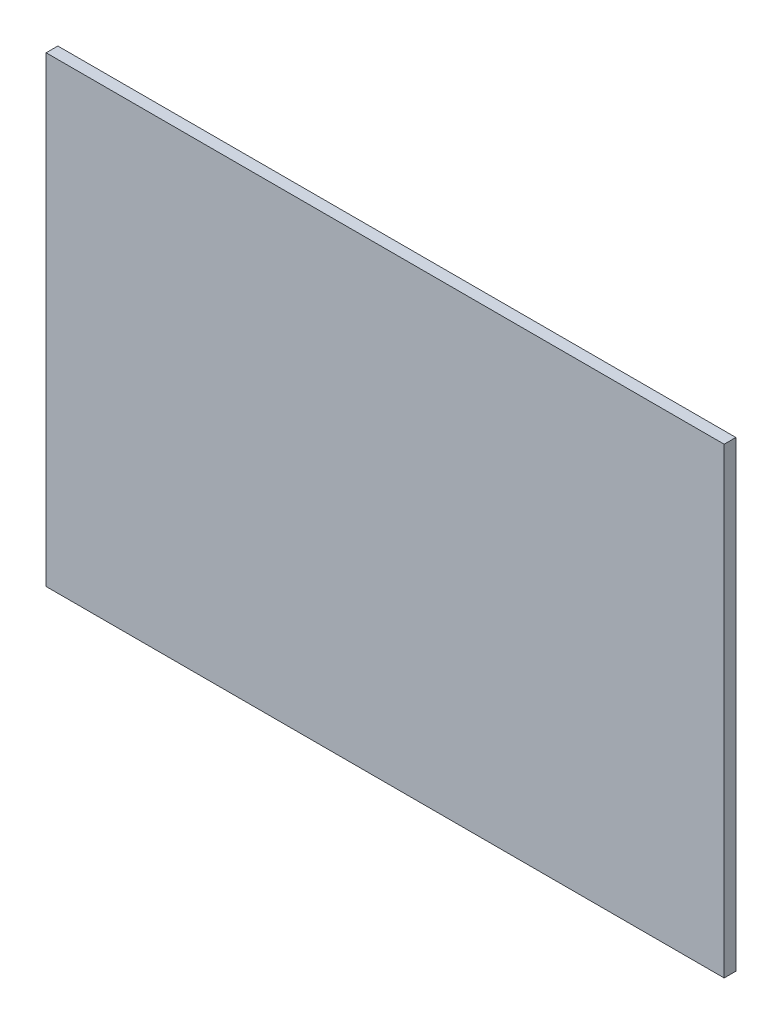
ISO-10303-21;
HEADER;
FILE_DESCRIPTION(('STEP AP214'),'2;1');
FILE_NAME('part.step','',(''),(''),'','','');
FILE_SCHEMA(('AUTOMOTIVE_DESIGN { 1 0 10303 214 1 1 1 1 }'));
ENDSEC;
DATA;
#1=APPLICATION_CONTEXT('core data for automotive mechanical design processes');
#2=APPLICATION_PROTOCOL_DEFINITION('international standard','automotive_design',2000,#1);
#3=PRODUCT_CONTEXT('',#1,'mechanical');
#4=PRODUCT('Part','Part','',(#3));
#5=PRODUCT_RELATED_PRODUCT_CATEGORY('part','',(#4));
#6=PRODUCT_DEFINITION_FORMATION('','',#4);
#7=PRODUCT_DEFINITION_CONTEXT('part definition',#1,'design');
#8=PRODUCT_DEFINITION('design','',#6,#7);
#9=PRODUCT_DEFINITION_SHAPE('','',#8);
#10=(LENGTH_UNIT() NAMED_UNIT(*) SI_UNIT(.MILLI.,.METRE.));
#11=(NAMED_UNIT(*) PLANE_ANGLE_UNIT() SI_UNIT($,.RADIAN.));
#12=(NAMED_UNIT(*) SI_UNIT($,.STERADIAN.) SOLID_ANGLE_UNIT());
#13=UNCERTAINTY_MEASURE_WITH_UNIT(LENGTH_MEASURE(1.E-05),#10,'distance_accuracy_value','');
#14=(GEOMETRIC_REPRESENTATION_CONTEXT(3) GLOBAL_UNCERTAINTY_ASSIGNED_CONTEXT((#13)) GLOBAL_UNIT_ASSIGNED_CONTEXT((#10,
#11,#12)) REPRESENTATION_CONTEXT('',''));
#15=CARTESIAN_POINT('',(0.,0.,0.));
#16=DIRECTION('',(0.,0.,1.));
#17=DIRECTION('',(1.,0.,0.));
#18=AXIS2_PLACEMENT_3D('',#15,#16,#17);
#19=CARTESIAN_POINT('',(139.7,-95.25,4.826));
#20=DIRECTION('',(-1.,0.,0.));
#21=DIRECTION('',(0.,0.,1.));
#22=AXIS2_PLACEMENT_3D('',#19,#20,#21);
#23=PLANE('',#22);
#24=DIRECTION('',(0.,1.,0.));
#25=VECTOR('',#24,1.);
#26=CARTESIAN_POINT('',(139.7,-95.25,0.));
#27=LINE('',#26,#25);
#28=CARTESIAN_POINT('',(139.7,-95.25,0.));
#29=VERTEX_POINT('',#28);
#30=CARTESIAN_POINT('',(139.7,95.25,0.));
#31=VERTEX_POINT('',#30);
#32=EDGE_CURVE('E107',#29,#31,#27,.T.);
#33=ORIENTED_EDGE('',*,*,#32,.T.);
#34=DIRECTION('',(0.,0.,-1.));
#35=VECTOR('',#34,1.);
#36=CARTESIAN_POINT('',(139.7,95.25,4.826));
#37=LINE('',#36,#35);
#38=CARTESIAN_POINT('',(139.7,95.25,4.826));
#39=VERTEX_POINT('',#38);
#40=EDGE_CURVE('E11',#39,#31,#37,.T.);
#41=ORIENTED_EDGE('',*,*,#40,.F.);
#42=DIRECTION('',(0.,1.,0.));
#43=VECTOR('',#42,1.);
#44=CARTESIAN_POINT('',(139.7,-95.25,4.826));
#45=LINE('',#44,#43);
#46=CARTESIAN_POINT('',(139.7,-95.25,4.826));
#47=VERTEX_POINT('',#46);
#48=EDGE_CURVE('E91',#47,#39,#45,.T.);
#49=ORIENTED_EDGE('',*,*,#48,.F.);
#50=DIRECTION('',(0.,0.,-1.));
#51=VECTOR('',#50,1.);
#52=CARTESIAN_POINT('',(139.7,-95.25,4.826));
#53=LINE('',#52,#51);
#54=EDGE_CURVE('E103',#47,#29,#53,.T.);
#55=ORIENTED_EDGE('',*,*,#54,.T.);
#56=EDGE_LOOP('',(#33,#41,#49,#55));
#57=FACE_BOUND('',#56,.T.);
#58=ADVANCED_FACE('F39',(#57),#23,.F.);
#59=CARTESIAN_POINT('',(-139.7,95.25,4.826));
#60=DIRECTION('',(0.,-1.,0.));
#61=DIRECTION('',(0.,0.,-1.));
#62=AXIS2_PLACEMENT_3D('',#59,#60,#61);
#63=PLANE('',#62);
#64=DIRECTION('',(-1.,0.,0.));
#65=VECTOR('',#64,1.);
#66=CARTESIAN_POINT('',(-139.7,95.25,0.));
#67=LINE('',#66,#65);
#68=CARTESIAN_POINT('',(-139.7,95.25,0.));
#69=VERTEX_POINT('',#68);
#70=EDGE_CURVE('E96',#31,#69,#67,.T.);
#71=ORIENTED_EDGE('',*,*,#70,.T.);
#72=DIRECTION('',(0.,0.,-1.));
#73=VECTOR('',#72,1.);
#74=CARTESIAN_POINT('',(-139.7,95.25,4.826));
#75=LINE('',#74,#73);
#76=CARTESIAN_POINT('',(-139.7,95.25,4.826));
#77=VERTEX_POINT('',#76);
#78=EDGE_CURVE('E48',#77,#69,#75,.T.);
#79=ORIENTED_EDGE('',*,*,#78,.F.);
#80=DIRECTION('',(-1.,0.,0.));
#81=VECTOR('',#80,1.);
#82=CARTESIAN_POINT('',(-139.7,95.25,4.826));
#83=LINE('',#82,#81);
#84=EDGE_CURVE('E86',#39,#77,#83,.T.);
#85=ORIENTED_EDGE('',*,*,#84,.F.);
#86=ORIENTED_EDGE('',*,*,#40,.T.);
#87=EDGE_LOOP('',(#71,#79,#85,#86));
#88=FACE_BOUND('',#87,.T.);
#89=ADVANCED_FACE('F95',(#88),#63,.F.);
#90=CARTESIAN_POINT('',(-139.7,-95.25,4.826));
#91=DIRECTION('',(1.,0.,0.));
#92=DIRECTION('',(0.,0.,-1.));
#93=AXIS2_PLACEMENT_3D('',#90,#91,#92);
#94=PLANE('',#93);
#95=DIRECTION('',(0.,-1.,0.));
#96=VECTOR('',#95,1.);
#97=CARTESIAN_POINT('',(-139.7,-95.25,0.));
#98=LINE('',#97,#96);
#99=CARTESIAN_POINT('',(-139.7,-95.25,0.));
#100=VERTEX_POINT('',#99);
#101=EDGE_CURVE('E73',#69,#100,#98,.T.);
#102=ORIENTED_EDGE('',*,*,#101,.T.);
#103=DIRECTION('',(0.,0.,-1.));
#104=VECTOR('',#103,1.);
#105=CARTESIAN_POINT('',(-139.7,-95.25,4.826));
#106=LINE('',#105,#104);
#107=CARTESIAN_POINT('',(-139.7,-95.25,4.826));
#108=VERTEX_POINT('',#107);
#109=EDGE_CURVE('E98',#108,#100,#106,.T.);
#110=ORIENTED_EDGE('',*,*,#109,.F.);
#111=DIRECTION('',(0.,-1.,0.));
#112=VECTOR('',#111,1.);
#113=CARTESIAN_POINT('',(-139.7,-95.25,4.826));
#114=LINE('',#113,#112);
#115=EDGE_CURVE('E89',#77,#108,#114,.T.);
#116=ORIENTED_EDGE('',*,*,#115,.F.);
#117=ORIENTED_EDGE('',*,*,#78,.T.);
#118=EDGE_LOOP('',(#102,#110,#116,#117));
#119=FACE_BOUND('',#118,.T.);
#120=ADVANCED_FACE('F99',(#119),#94,.F.);
#121=CARTESIAN_POINT('',(-139.7,-95.25,4.826));
#122=DIRECTION('',(0.,1.,0.));
#123=DIRECTION('',(0.,0.,1.));
#124=AXIS2_PLACEMENT_3D('',#121,#122,#123);
#125=PLANE('',#124);
#126=DIRECTION('',(1.,0.,0.));
#127=VECTOR('',#126,1.);
#128=CARTESIAN_POINT('',(-139.7,-95.25,0.));
#129=LINE('',#128,#127);
#130=EDGE_CURVE('E79',#100,#29,#129,.T.);
#131=ORIENTED_EDGE('',*,*,#130,.T.);
#132=ORIENTED_EDGE('',*,*,#54,.F.);
#133=DIRECTION('',(1.,0.,0.));
#134=VECTOR('',#133,1.);
#135=CARTESIAN_POINT('',(-139.7,-95.25,4.826));
#136=LINE('',#135,#134);
#137=EDGE_CURVE('E56',#108,#47,#136,.T.);
#138=ORIENTED_EDGE('',*,*,#137,.F.);
#139=ORIENTED_EDGE('',*,*,#109,.T.);
#140=EDGE_LOOP('',(#131,#132,#138,#139));
#141=FACE_BOUND('',#140,.T.);
#142=ADVANCED_FACE('F120',(#141),#125,.F.);
#143=CARTESIAN_POINT('',(0.,0.,4.826));
#144=DIRECTION('',(0.,0.,-1.));
#145=DIRECTION('',(-1.,0.,0.));
#146=AXIS2_PLACEMENT_3D('',#143,#144,#145);
#147=PLANE('',#146);
#148=ORIENTED_EDGE('',*,*,#48,.T.);
#149=ORIENTED_EDGE('',*,*,#84,.T.);
#150=ORIENTED_EDGE('',*,*,#115,.T.);
#151=ORIENTED_EDGE('',*,*,#137,.T.);
#152=EDGE_LOOP('',(#148,#149,#150,#151));
#153=FACE_BOUND('',#152,.T.);
#154=ADVANCED_FACE('F87',(#153),#147,.F.);
#155=CARTESIAN_POINT('',(0.,0.,0.));
#156=DIRECTION('',(0.,0.,-1.));
#157=DIRECTION('',(-1.,0.,0.));
#158=AXIS2_PLACEMENT_3D('',#155,#156,#157);
#159=PLANE('',#158);
#160=ORIENTED_EDGE('',*,*,#32,.F.);
#161=ORIENTED_EDGE('',*,*,#130,.F.);
#162=ORIENTED_EDGE('',*,*,#101,.F.);
#163=ORIENTED_EDGE('',*,*,#70,.F.);
#164=EDGE_LOOP('',(#160,#161,#162,#163));
#165=FACE_BOUND('',#164,.T.);
#166=ADVANCED_FACE('F123',(#165),#159,.T.);
#167=CLOSED_SHELL('',(#58,#89,#120,#142,#154,#166));
#168=MANIFOLD_SOLID_BREP('B2',#167);
#169=ADVANCED_BREP_SHAPE_REPRESENTATION('',(#18,#168),#14);
#170=SHAPE_DEFINITION_REPRESENTATION(#9,#169);
ENDSEC;
END-ISO-10303-21;
